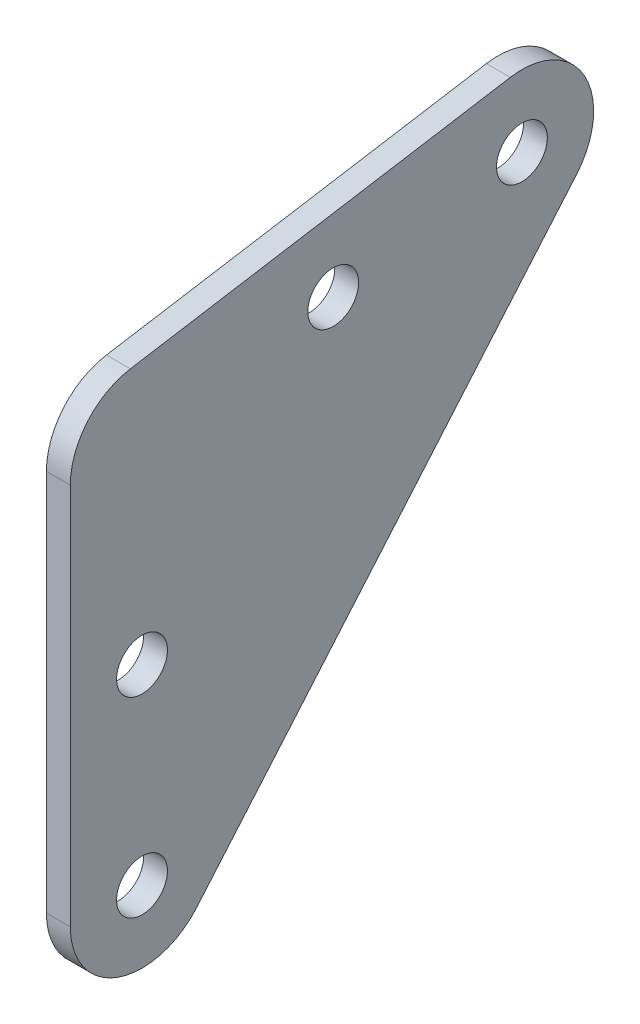
ISO-10303-21;
HEADER;
FILE_DESCRIPTION(('STEP AP214'),'2;1');
FILE_NAME('part.step','',(''),(''),'','','');
FILE_SCHEMA(('AUTOMOTIVE_DESIGN { 1 0 10303 214 1 1 1 1 }'));
ENDSEC;
DATA;
#1=APPLICATION_CONTEXT('core data for automotive mechanical design processes');
#2=APPLICATION_PROTOCOL_DEFINITION('international standard','automotive_design',2000,#1);
#3=PRODUCT_CONTEXT('',#1,'mechanical');
#4=PRODUCT('Part','Part','',(#3));
#5=PRODUCT_RELATED_PRODUCT_CATEGORY('part','',(#4));
#6=PRODUCT_DEFINITION_FORMATION('','',#4);
#7=PRODUCT_DEFINITION_CONTEXT('part definition',#1,'design');
#8=PRODUCT_DEFINITION('design','',#6,#7);
#9=PRODUCT_DEFINITION_SHAPE('','',#8);
#10=(LENGTH_UNIT() NAMED_UNIT(*) SI_UNIT(.MILLI.,.METRE.));
#11=(NAMED_UNIT(*) PLANE_ANGLE_UNIT() SI_UNIT($,.RADIAN.));
#12=(NAMED_UNIT(*) SI_UNIT($,.STERADIAN.) SOLID_ANGLE_UNIT());
#13=UNCERTAINTY_MEASURE_WITH_UNIT(LENGTH_MEASURE(1.E-05),#10,'distance_accuracy_value','');
#14=(GEOMETRIC_REPRESENTATION_CONTEXT(3) GLOBAL_UNCERTAINTY_ASSIGNED_CONTEXT((#13)) GLOBAL_UNIT_ASSIGNED_CONTEXT((#10,
#11,#12)) REPRESENTATION_CONTEXT('',''));
#15=CARTESIAN_POINT('',(0.,0.,0.));
#16=DIRECTION('',(0.,0.,1.));
#17=DIRECTION('',(1.,0.,0.));
#18=AXIS2_PLACEMENT_3D('',#15,#16,#17);
#19=CARTESIAN_POINT('',(92.8688124839999,323.577914145841,1304.62002205645));
#20=DIRECTION('',(0.,0.986762512438189,0.162171958262434));
#21=DIRECTION('',(0.,-0.162171958262434,0.986762512438189));
#22=AXIS2_PLACEMENT_3D('',#19,#20,#21);
#23=PLANE('',#22);
#24=DIRECTION('',(0.,-0.162171958262431,0.986762512438189));
#25=VECTOR('',#24,1.);
#26=CARTESIAN_POINT('',(92.8688124839999,318.09194309198,1338.000334154));
#27=LINE('',#26,#25);
#28=CARTESIAN_POINT('',(92.8688124839999,327.697081885707,1279.55625424052));
#29=VERTEX_POINT('',#28);
#30=CARTESIAN_POINT('',(92.8688124839999,319.403487484974,1330.02002205645));
#31=VERTEX_POINT('',#30);
#32=EDGE_CURVE('E99',#29,#31,#27,.T.);
#33=ORIENTED_EDGE('',*,*,#32,.T.);
#34=DIRECTION('',(1.,0.,0.));
#35=VECTOR('',#34,1.);
#36=CARTESIAN_POINT('',(92.8688124839999,319.403487484974,1330.02002205645));
#37=LINE('',#36,#35);
#38=CARTESIAN_POINT('',(96.0438124839999,319.403487484974,1330.02002205645));
#39=VERTEX_POINT('',#38);
#40=EDGE_CURVE('E134',#31,#39,#37,.T.);
#41=ORIENTED_EDGE('',*,*,#40,.T.);
#42=DIRECTION('',(0.,-0.162171958262434,0.986762512438189));
#43=VECTOR('',#42,1.);
#44=CARTESIAN_POINT('',(96.0438124839999,323.577914145841,1304.62002205645));
#45=LINE('',#44,#43);
#46=CARTESIAN_POINT('',(96.0438124839999,327.697081885707,1279.55625424052));
#47=VERTEX_POINT('',#46);
#48=EDGE_CURVE('E130',#47,#39,#45,.T.);
#49=ORIENTED_EDGE('',*,*,#48,.F.);
#50=DIRECTION('',(1.,0.,0.));
#51=VECTOR('',#50,1.);
#52=CARTESIAN_POINT('',(92.8688124839999,327.697081885707,1279.55625424052));
#53=LINE('',#52,#51);
#54=EDGE_CURVE('E132',#29,#47,#53,.T.);
#55=ORIENTED_EDGE('',*,*,#54,.F.);
#56=EDGE_LOOP('',(#33,#41,#49,#55));
#57=FACE_BOUND('',#56,.T.);
#58=ADVANCED_FACE('F41',(#57),#23,.T.);
#59=CARTESIAN_POINT('',(92.8688124839999,318.298168954733,1278.01156633807));
#60=DIRECTION('',(1.,0.,0.));
#61=DIRECTION('',(0.,0.,-1.));
#62=AXIS2_PLACEMENT_3D('',#59,#60,#61);
#63=CYLINDRICAL_SURFACE('',#62,9.52500000000011);
#64=CARTESIAN_POINT('',(96.0438124839999,318.298168954733,1278.01156633807));
#65=DIRECTION('',(1.,0.,0.));
#66=DIRECTION('',(0.,0.,-1.));
#67=AXIS2_PLACEMENT_3D('',#64,#65,#66);
#68=CIRCLE('',#67,9.52500000000011);
#69=CARTESIAN_POINT('',(96.0438124839999,312.112667450239,1270.7682800578));
#70=VERTEX_POINT('',#69);
#71=EDGE_CURVE('E127',#70,#47,#68,.T.);
#72=ORIENTED_EDGE('',*,*,#71,.F.);
#73=DIRECTION('',(1.,0.,0.));
#74=VECTOR('',#73,1.);
#75=CARTESIAN_POINT('',(92.8688124839999,312.112667450239,1270.7682800578));
#76=LINE('',#75,#74);
#77=CARTESIAN_POINT('',(92.8688124839999,312.112667450239,1270.7682800578));
#78=VERTEX_POINT('',#77);
#79=EDGE_CURVE('E135',#78,#70,#76,.T.);
#80=ORIENTED_EDGE('',*,*,#79,.F.);
#81=CARTESIAN_POINT('',(92.8688124839999,318.298168954733,1278.01156633807));
#82=DIRECTION('',(1.,0.,0.));
#83=DIRECTION('',(0.,0.,-1.));
#84=AXIS2_PLACEMENT_3D('',#81,#82,#83);
#85=CIRCLE('',#84,9.52500000000011);
#86=EDGE_CURVE('E107',#78,#29,#85,.T.);
#87=ORIENTED_EDGE('',*,*,#86,.T.);
#88=ORIENTED_EDGE('',*,*,#54,.T.);
#89=EDGE_LOOP('',(#72,#80,#87,#88));
#90=FACE_BOUND('',#89,.T.);
#91=ADVANCED_FACE('F150',(#90),#63,.T.);
#92=CARTESIAN_POINT('',(92.8688124839999,253.019073049506,1321.23204787373));
#93=DIRECTION('',(0.,-0.649396483411456,-0.760450003177615));
#94=DIRECTION('',(0.,0.760450003177615,-0.649396483411456));
#95=AXIS2_PLACEMENT_3D('',#92,#93,#94);
#96=PLANE('',#95);
#97=DIRECTION('',(0.,0.760450003177615,-0.649396483411456));
#98=VECTOR('',#97,1.);
#99=CARTESIAN_POINT('',(96.0438124839999,253.019073049506,1321.23204787373));
#100=LINE('',#99,#98);
#101=CARTESIAN_POINT('',(96.0438124839999,253.019073049506,1321.23204787373));
#102=VERTEX_POINT('',#101);
#103=EDGE_CURVE('E124',#102,#70,#100,.T.);
#104=ORIENTED_EDGE('',*,*,#103,.F.);
#105=DIRECTION('',(1.,0.,0.));
#106=VECTOR('',#105,1.);
#107=CARTESIAN_POINT('',(92.8688124839999,253.019073049506,1321.23204787373));
#108=LINE('',#107,#106);
#109=CARTESIAN_POINT('',(92.8688124839999,253.019073049506,1321.23204787373));
#110=VERTEX_POINT('',#109);
#111=EDGE_CURVE('E106',#110,#102,#108,.T.);
#112=ORIENTED_EDGE('',*,*,#111,.F.);
#113=DIRECTION('',(0.,0.760450003177615,-0.649396483411456));
#114=VECTOR('',#113,1.);
#115=CARTESIAN_POINT('',(92.8688124839999,253.019073049506,1321.23204787373));
#116=LINE('',#115,#114);
#117=EDGE_CURVE('E113',#110,#78,#116,.T.);
#118=ORIENTED_EDGE('',*,*,#117,.T.);
#119=ORIENTED_EDGE('',*,*,#79,.T.);
#120=EDGE_LOOP('',(#104,#112,#118,#119));
#121=FACE_BOUND('',#120,.T.);
#122=ADVANCED_FACE('F152',(#121),#96,.T.);
#123=CARTESIAN_POINT('',(92.8688124839999,259.204574554,1328.475334154));
#124=DIRECTION('',(1.,0.,0.));
#125=DIRECTION('',(0.,0.,-1.));
#126=AXIS2_PLACEMENT_3D('',#123,#124,#125);
#127=CYLINDRICAL_SURFACE('',#126,9.52499999999997);
#128=CARTESIAN_POINT('',(96.0438124839999,259.204574554,1328.475334154));
#129=DIRECTION('',(1.,0.,0.));
#130=DIRECTION('',(0.,0.,-1.));
#131=AXIS2_PLACEMENT_3D('',#128,#129,#130);
#132=CIRCLE('',#131,9.52499999999997);
#133=CARTESIAN_POINT('',(96.0438124839999,259.204574554,1338.000334154));
#134=VERTEX_POINT('',#133);
#135=EDGE_CURVE('E105',#134,#102,#132,.T.);
#136=ORIENTED_EDGE('',*,*,#135,.F.);
#137=DIRECTION('',(1.,0.,0.));
#138=VECTOR('',#137,1.);
#139=CARTESIAN_POINT('',(92.8688124839999,259.204574554,1338.000334154));
#140=LINE('',#139,#138);
#141=CARTESIAN_POINT('',(92.8688124839999,259.204574554,1338.000334154));
#142=VERTEX_POINT('',#141);
#143=EDGE_CURVE('E93',#142,#134,#140,.T.);
#144=ORIENTED_EDGE('',*,*,#143,.F.);
#145=CARTESIAN_POINT('',(92.8688124839999,259.204574554,1328.475334154));
#146=DIRECTION('',(1.,0.,0.));
#147=DIRECTION('',(0.,0.,-1.));
#148=AXIS2_PLACEMENT_3D('',#145,#146,#147);
#149=CIRCLE('',#148,9.52499999999997);
#150=EDGE_CURVE('E98',#142,#110,#149,.T.);
#151=ORIENTED_EDGE('',*,*,#150,.T.);
#152=ORIENTED_EDGE('',*,*,#111,.T.);
#153=EDGE_LOOP('',(#136,#144,#151,#152));
#154=FACE_BOUND('',#153,.T.);
#155=ADVANCED_FACE('F103',(#154),#127,.T.);
#156=CARTESIAN_POINT('',(92.8688124839999,259.204574554,1338.000334154));
#157=DIRECTION('',(0.,0.,1.));
#158=DIRECTION('',(1.,0.,0.));
#159=AXIS2_PLACEMENT_3D('',#156,#157,#158);
#160=PLANE('',#159);
#161=DIRECTION('',(0.,-1.,0.));
#162=VECTOR('',#161,1.);
#163=CARTESIAN_POINT('',(96.0438124839999,259.204574554,1338.000334154));
#164=LINE('',#163,#162);
#165=CARTESIAN_POINT('',(96.0438124839999,310.004574554,1338.000334154));
#166=VERTEX_POINT('',#165);
#167=EDGE_CURVE('E120',#166,#134,#164,.T.);
#168=ORIENTED_EDGE('',*,*,#167,.F.);
#169=DIRECTION('',(1.,0.,0.));
#170=VECTOR('',#169,1.);
#171=CARTESIAN_POINT('',(92.8688124839999,310.004574554,1338.000334154));
#172=LINE('',#171,#170);
#173=CARTESIAN_POINT('',(92.8688124839999,310.004574554,1338.000334154));
#174=VERTEX_POINT('',#173);
#175=EDGE_CURVE('E49',#166,#174,#172,.F.);
#176=ORIENTED_EDGE('',*,*,#175,.T.);
#177=DIRECTION('',(0.,-1.,0.));
#178=VECTOR('',#177,1.);
#179=CARTESIAN_POINT('',(92.8688124839999,284.604574554,1338.000334154));
#180=LINE('',#179,#178);
#181=EDGE_CURVE('E90',#174,#142,#180,.T.);
#182=ORIENTED_EDGE('',*,*,#181,.T.);
#183=ORIENTED_EDGE('',*,*,#143,.T.);
#184=EDGE_LOOP('',(#168,#176,#182,#183));
#185=FACE_BOUND('',#184,.T.);
#186=ADVANCED_FACE('F92',(#185),#160,.T.);
#187=CARTESIAN_POINT('',(92.8688124839999,318.298168954733,1278.01156633807));
#188=DIRECTION('',(1.,0.,0.));
#189=DIRECTION('',(0.,0.,-1.));
#190=AXIS2_PLACEMENT_3D('',#187,#188,#189);
#191=PLANE('',#190);
#192=CARTESIAN_POINT('',(92.8688124839999,314.179001214867,1303.075334154));
#193=DIRECTION('',(1.,0.,0.));
#194=DIRECTION('',(0.,0.,-1.));
#195=AXIS2_PLACEMENT_3D('',#192,#193,#194);
#196=CIRCLE('',#195,3.3782);
#197=CARTESIAN_POINT('',(92.8688124839999,314.179001214867,1299.697134154));
#198=VERTEX_POINT('',#197);
#199=EDGE_CURVE('E199',#198,#198,#196,.T.);
#200=ORIENTED_EDGE('',*,*,#199,.T.);
#201=EDGE_LOOP('',(#200));
#202=FACE_BOUND('',#201,.T.);
#203=CARTESIAN_POINT('',(92.8688124839999,318.298168954733,1278.01156633807));
#204=DIRECTION('',(1.,0.,0.));
#205=DIRECTION('',(0.,0.,-1.));
#206=AXIS2_PLACEMENT_3D('',#203,#204,#205);
#207=CIRCLE('',#206,3.3782);
#208=CARTESIAN_POINT('',(92.8688124839999,318.298168954733,1274.63336633807));
#209=VERTEX_POINT('',#208);
#210=EDGE_CURVE('E209',#209,#209,#207,.T.);
#211=ORIENTED_EDGE('',*,*,#210,.T.);
#212=EDGE_LOOP('',(#211));
#213=FACE_BOUND('',#212,.T.);
#214=CARTESIAN_POINT('',(92.8688124839999,284.604574554,1328.475334154));
#215=DIRECTION('',(1.,0.,0.));
#216=DIRECTION('',(0.,0.,-1.));
#217=AXIS2_PLACEMENT_3D('',#214,#215,#216);
#218=CIRCLE('',#217,3.3782);
#219=CARTESIAN_POINT('',(92.8688124839999,284.604574554,1325.097134154));
#220=VERTEX_POINT('',#219);
#221=EDGE_CURVE('E215',#220,#220,#218,.T.);
#222=ORIENTED_EDGE('',*,*,#221,.T.);
#223=EDGE_LOOP('',(#222));
#224=FACE_BOUND('',#223,.T.);
#225=CARTESIAN_POINT('',(92.8688124839999,259.204574554,1328.475334154));
#226=DIRECTION('',(1.,0.,0.));
#227=DIRECTION('',(0.,0.,-1.));
#228=AXIS2_PLACEMENT_3D('',#225,#226,#227);
#229=CIRCLE('',#228,3.3782);
#230=CARTESIAN_POINT('',(92.8688124839999,259.204574554,1325.097134154));
#231=VERTEX_POINT('',#230);
#232=EDGE_CURVE('E122',#231,#231,#229,.T.);
#233=ORIENTED_EDGE('',*,*,#232,.T.);
#234=EDGE_LOOP('',(#233));
#235=FACE_BOUND('',#234,.T.);
#236=ORIENTED_EDGE('',*,*,#181,.F.);
#237=CARTESIAN_POINT('',(92.8688124839999,310.004574554,1328.475334154));
#238=DIRECTION('',(1.,0.,0.));
#239=DIRECTION('',(0.,0.,-1.));
#240=AXIS2_PLACEMENT_3D('',#237,#238,#239);
#241=CIRCLE('',#240,9.525);
#242=EDGE_CURVE('E11',#174,#31,#241,.F.);
#243=ORIENTED_EDGE('',*,*,#242,.T.);
#244=ORIENTED_EDGE('',*,*,#32,.F.);
#245=ORIENTED_EDGE('',*,*,#86,.F.);
#246=ORIENTED_EDGE('',*,*,#117,.F.);
#247=ORIENTED_EDGE('',*,*,#150,.F.);
#248=EDGE_LOOP('',(#236,#243,#244,#245,#246,#247));
#249=FACE_BOUND('',#248,.T.);
#250=ADVANCED_FACE('F110',(#202,#213,#224,#235,#249),#191,.F.);
#251=CARTESIAN_POINT('',(96.0438124839999,318.298168954733,1278.01156633807));
#252=DIRECTION('',(1.,0.,0.));
#253=DIRECTION('',(0.,0.,-1.));
#254=AXIS2_PLACEMENT_3D('',#251,#252,#253);
#255=PLANE('',#254);
#256=CARTESIAN_POINT('',(96.0438124839999,314.179001214867,1303.075334154));
#257=DIRECTION('',(1.,0.,0.));
#258=DIRECTION('',(0.,0.,-1.));
#259=AXIS2_PLACEMENT_3D('',#256,#257,#258);
#260=CIRCLE('',#259,3.3782);
#261=CARTESIAN_POINT('',(96.0438124839999,314.179001214867,1299.697134154));
#262=VERTEX_POINT('',#261);
#263=EDGE_CURVE('E202',#262,#262,#260,.T.);
#264=ORIENTED_EDGE('',*,*,#263,.F.);
#265=EDGE_LOOP('',(#264));
#266=FACE_BOUND('',#265,.T.);
#267=CARTESIAN_POINT('',(96.0438124839999,318.298168954733,1278.01156633807));
#268=DIRECTION('',(1.,0.,0.));
#269=DIRECTION('',(0.,0.,-1.));
#270=AXIS2_PLACEMENT_3D('',#267,#268,#269);
#271=CIRCLE('',#270,3.3782);
#272=CARTESIAN_POINT('',(96.0438124839999,318.298168954733,1274.63336633807));
#273=VERTEX_POINT('',#272);
#274=EDGE_CURVE('E204',#273,#273,#271,.T.);
#275=ORIENTED_EDGE('',*,*,#274,.F.);
#276=EDGE_LOOP('',(#275));
#277=FACE_BOUND('',#276,.T.);
#278=CARTESIAN_POINT('',(96.0438124839999,284.604574554,1328.475334154));
#279=DIRECTION('',(1.,0.,0.));
#280=DIRECTION('',(0.,0.,-1.));
#281=AXIS2_PLACEMENT_3D('',#278,#279,#280);
#282=CIRCLE('',#281,3.3782);
#283=CARTESIAN_POINT('',(96.0438124839999,284.604574554,1325.097134154));
#284=VERTEX_POINT('',#283);
#285=EDGE_CURVE('E212',#284,#284,#282,.T.);
#286=ORIENTED_EDGE('',*,*,#285,.F.);
#287=EDGE_LOOP('',(#286));
#288=FACE_BOUND('',#287,.T.);
#289=CARTESIAN_POINT('',(96.0438124839999,259.204574554,1328.475334154));
#290=DIRECTION('',(1.,0.,0.));
#291=DIRECTION('',(0.,0.,-1.));
#292=AXIS2_PLACEMENT_3D('',#289,#290,#291);
#293=CIRCLE('',#292,3.3782);
#294=CARTESIAN_POINT('',(96.0438124839999,259.204574554,1325.097134154));
#295=VERTEX_POINT('',#294);
#296=EDGE_CURVE('E218',#295,#295,#293,.T.);
#297=ORIENTED_EDGE('',*,*,#296,.F.);
#298=EDGE_LOOP('',(#297));
#299=FACE_BOUND('',#298,.T.);
#300=ORIENTED_EDGE('',*,*,#48,.T.);
#301=CARTESIAN_POINT('',(96.0438124839999,310.004574554,1328.475334154));
#302=DIRECTION('',(1.,0.,0.));
#303=DIRECTION('',(0.,0.,-1.));
#304=AXIS2_PLACEMENT_3D('',#301,#302,#303);
#305=CIRCLE('',#304,9.525);
#306=EDGE_CURVE('E63',#39,#166,#305,.T.);
#307=ORIENTED_EDGE('',*,*,#306,.T.);
#308=ORIENTED_EDGE('',*,*,#167,.T.);
#309=ORIENTED_EDGE('',*,*,#135,.T.);
#310=ORIENTED_EDGE('',*,*,#103,.T.);
#311=ORIENTED_EDGE('',*,*,#71,.T.);
#312=EDGE_LOOP('',(#300,#307,#308,#309,#310,#311));
#313=FACE_BOUND('',#312,.T.);
#314=ADVANCED_FACE('F146',(#266,#277,#288,#299,#313),#255,.T.);
#315=CARTESIAN_POINT('',(92.8688124839999,310.004574554,1328.475334154));
#316=DIRECTION('',(1.,0.,0.));
#317=DIRECTION('',(0.,0.,-1.));
#318=AXIS2_PLACEMENT_3D('',#315,#316,#317);
#319=CYLINDRICAL_SURFACE('',#318,9.525);
#320=ORIENTED_EDGE('',*,*,#242,.F.);
#321=ORIENTED_EDGE('',*,*,#175,.F.);
#322=ORIENTED_EDGE('',*,*,#306,.F.);
#323=ORIENTED_EDGE('',*,*,#40,.F.);
#324=EDGE_LOOP('',(#320,#321,#322,#323));
#325=FACE_BOUND('',#324,.T.);
#326=ADVANCED_FACE('F43',(#325),#319,.T.);
#327=CARTESIAN_POINT('',(96.0438124839999,259.204574554,1328.475334154));
#328=DIRECTION('',(1.,0.,0.));
#329=DIRECTION('',(0.,0.,-1.));
#330=AXIS2_PLACEMENT_3D('',#327,#328,#329);
#331=CYLINDRICAL_SURFACE('',#330,3.3782);
#332=ORIENTED_EDGE('',*,*,#232,.F.);
#333=EDGE_LOOP('',(#332));
#334=FACE_BOUND('',#333,.T.);
#335=ORIENTED_EDGE('',*,*,#296,.T.);
#336=EDGE_LOOP('',(#335));
#337=FACE_BOUND('',#336,.T.);
#338=ADVANCED_FACE('F154',(#334,#337),#331,.F.);
#339=CARTESIAN_POINT('',(96.0438124839999,284.604574554,1328.475334154));
#340=DIRECTION('',(1.,0.,0.));
#341=DIRECTION('',(0.,0.,-1.));
#342=AXIS2_PLACEMENT_3D('',#339,#340,#341);
#343=CYLINDRICAL_SURFACE('',#342,3.3782);
#344=ORIENTED_EDGE('',*,*,#221,.F.);
#345=EDGE_LOOP('',(#344));
#346=FACE_BOUND('',#345,.T.);
#347=ORIENTED_EDGE('',*,*,#285,.T.);
#348=EDGE_LOOP('',(#347));
#349=FACE_BOUND('',#348,.T.);
#350=ADVANCED_FACE('F160',(#346,#349),#343,.F.);
#351=CARTESIAN_POINT('',(96.0438124839999,318.298168954733,1278.01156633807));
#352=DIRECTION('',(1.,0.,0.));
#353=DIRECTION('',(0.,0.,-1.));
#354=AXIS2_PLACEMENT_3D('',#351,#352,#353);
#355=CYLINDRICAL_SURFACE('',#354,3.3782);
#356=ORIENTED_EDGE('',*,*,#210,.F.);
#357=EDGE_LOOP('',(#356));
#358=FACE_BOUND('',#357,.T.);
#359=ORIENTED_EDGE('',*,*,#274,.T.);
#360=EDGE_LOOP('',(#359));
#361=FACE_BOUND('',#360,.T.);
#362=ADVANCED_FACE('F187',(#358,#361),#355,.F.);
#363=CARTESIAN_POINT('',(96.0438124839999,314.179001214867,1303.075334154));
#364=DIRECTION('',(1.,0.,0.));
#365=DIRECTION('',(0.,0.,-1.));
#366=AXIS2_PLACEMENT_3D('',#363,#364,#365);
#367=CYLINDRICAL_SURFACE('',#366,3.3782);
#368=ORIENTED_EDGE('',*,*,#199,.F.);
#369=EDGE_LOOP('',(#368));
#370=FACE_BOUND('',#369,.T.);
#371=ORIENTED_EDGE('',*,*,#263,.T.);
#372=EDGE_LOOP('',(#371));
#373=FACE_BOUND('',#372,.T.);
#374=ADVANCED_FACE('F191',(#370,#373),#367,.F.);
#375=CLOSED_SHELL('',(#58,#91,#122,#155,#186,#250,#314,#326,#338,#350,#362,#374));
#376=MANIFOLD_SOLID_BREP('B2',#375);
#377=ADVANCED_BREP_SHAPE_REPRESENTATION('',(#18,#376),#14);
#378=SHAPE_DEFINITION_REPRESENTATION(#9,#377);
ENDSEC;
END-ISO-10303-21;
